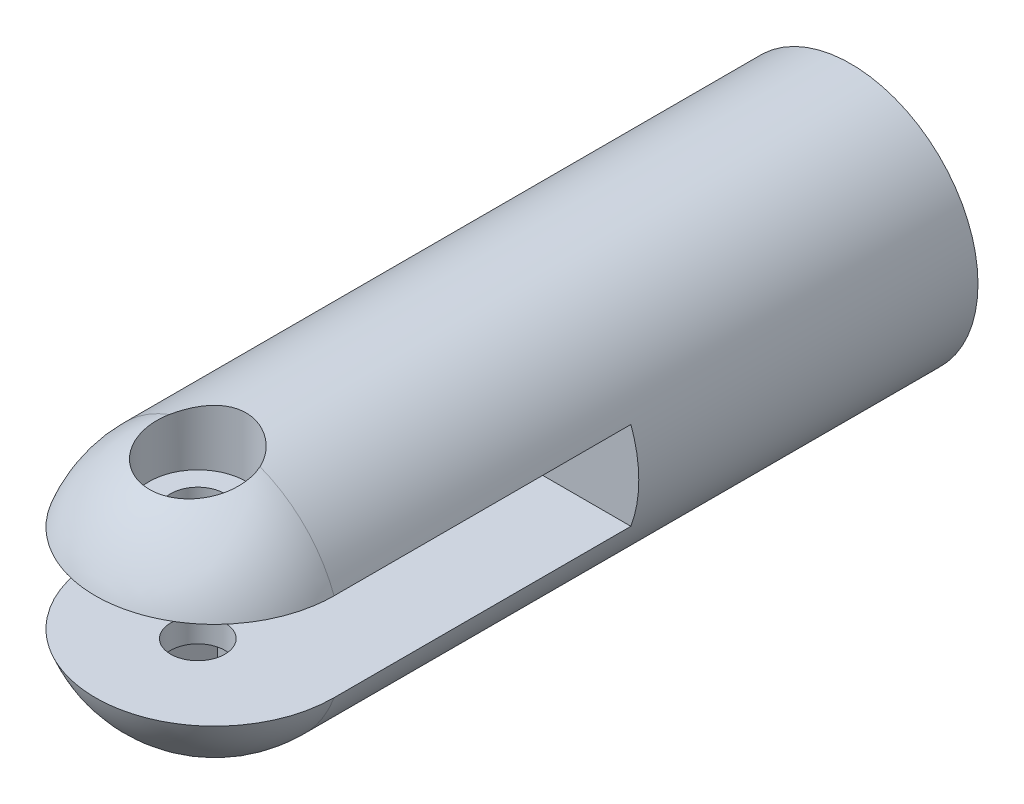
ISO-10303-21;
HEADER;
FILE_DESCRIPTION(('STEP AP214'),'2;1');
FILE_NAME('part.step','',(''),(''),'','','');
FILE_SCHEMA(('AUTOMOTIVE_DESIGN { 1 0 10303 214 1 1 1 1 }'));
ENDSEC;
DATA;
#1=APPLICATION_CONTEXT('core data for automotive mechanical design processes');
#2=APPLICATION_PROTOCOL_DEFINITION('international standard','automotive_design',2000,#1);
#3=PRODUCT_CONTEXT('',#1,'mechanical');
#4=PRODUCT('Part','Part','',(#3));
#5=PRODUCT_RELATED_PRODUCT_CATEGORY('part','',(#4));
#6=PRODUCT_DEFINITION_FORMATION('','',#4);
#7=PRODUCT_DEFINITION_CONTEXT('part definition',#1,'design');
#8=PRODUCT_DEFINITION('design','',#6,#7);
#9=PRODUCT_DEFINITION_SHAPE('','',#8);
#10=(LENGTH_UNIT() NAMED_UNIT(*) SI_UNIT(.MILLI.,.METRE.));
#11=(NAMED_UNIT(*) PLANE_ANGLE_UNIT() SI_UNIT($,.RADIAN.));
#12=(NAMED_UNIT(*) SI_UNIT($,.STERADIAN.) SOLID_ANGLE_UNIT());
#13=UNCERTAINTY_MEASURE_WITH_UNIT(LENGTH_MEASURE(1.E-05),#10,'distance_accuracy_value','');
#14=(GEOMETRIC_REPRESENTATION_CONTEXT(3) GLOBAL_UNCERTAINTY_ASSIGNED_CONTEXT((#13)) GLOBAL_UNIT_ASSIGNED_CONTEXT((#10,
#11,#12)) REPRESENTATION_CONTEXT('',''));
#15=CARTESIAN_POINT('',(0.,0.,0.));
#16=DIRECTION('',(0.,0.,1.));
#17=DIRECTION('',(1.,0.,0.));
#18=AXIS2_PLACEMENT_3D('',#15,#16,#17);
#19=CARTESIAN_POINT('',(0.,0.,-10.5));
#20=DIRECTION('',(0.,0.,-1.));
#21=DIRECTION('',(-1.,0.,0.));
#22=AXIS2_PLACEMENT_3D('',#19,#20,#21);
#23=PLANE('',#22);
#24=CARTESIAN_POINT('',(0.,0.,-10.5));
#25=DIRECTION('',(0.,0.,-1.));
#26=DIRECTION('',(-1.,0.,0.));
#27=AXIS2_PLACEMENT_3D('',#24,#25,#26);
#28=CIRCLE('',#27,3.);
#29=CARTESIAN_POINT('',(-3.,0.,-10.5));
#30=VERTEX_POINT('',#29);
#31=EDGE_CURVE('E217',#30,#30,#28,.T.);
#32=ORIENTED_EDGE('',*,*,#31,.T.);
#33=EDGE_LOOP('',(#32));
#34=FACE_BOUND('',#33,.T.);
#35=ADVANCED_FACE('F17',(#34),#23,.T.);
#36=CARTESIAN_POINT('',(-3.17500000000001,-7.5,16.));
#37=DIRECTION('',(-0.866025403784437,0.,0.500000000000002));
#38=DIRECTION('',(0.500000000000002,0.,0.866025403784437));
#39=AXIS2_PLACEMENT_3D('',#36,#37,#38);
#40=PLANE('',#39);
#41=DIRECTION('',(0.500000000000001,0.,0.866025403784438));
#42=VECTOR('',#41,1.);
#43=CARTESIAN_POINT('',(-3.17500000000001,-4.,16.));
#44=LINE('',#43,#42);
#45=CARTESIAN_POINT('',(-3.17500000000001,-4.,16.));
#46=VERTEX_POINT('',#45);
#47=CARTESIAN_POINT('',(-1.5875,-4.,18.7496306570156));
#48=VERTEX_POINT('',#47);
#49=EDGE_CURVE('E336',#46,#48,#44,.T.);
#50=ORIENTED_EDGE('',*,*,#49,.T.);
#51=DIRECTION('',(0.,1.,0.));
#52=VECTOR('',#51,1.);
#53=CARTESIAN_POINT('',(-1.5875,-7.5,18.7496306570156));
#54=LINE('',#53,#52);
#55=CARTESIAN_POINT('',(-1.58749999999999,-6.29842152336351,18.7496306570156));
#56=VERTEX_POINT('',#55);
#57=EDGE_CURVE('E337',#48,#56,#54,.F.);
#58=ORIENTED_EDGE('',*,*,#57,.T.);
#59=CARTESIAN_POINT('',(-3.17500000000001,-6.72081654265313,16.));
#60=CARTESIAN_POINT('',(-3.07960259323032,-6.74132007600086,16.1652331554354));
#61=CARTESIAN_POINT('',(-2.98376701938625,-6.75365654608878,16.3312252385059));
#62=CARTESIAN_POINT('',(-2.79187969375148,-6.76200191442739,16.6635838358338));
#63=CARTESIAN_POINT('',(-2.69582787083722,-6.75800428130594,16.8299504732809));
#64=CARTESIAN_POINT('',(-2.50613212754692,-6.73391120791016,17.1585131386392));
#65=CARTESIAN_POINT('',(-2.41247803994855,-6.71413434789136,17.3207267766961));
#66=CARTESIAN_POINT('',(-2.2263653028032,-6.65903730530723,17.6430834933676));
#67=CARTESIAN_POINT('',(-2.13390605968537,-6.62372517188927,17.803227600077));
#68=CARTESIAN_POINT('',(-1.96533097033463,-6.54463092953193,18.095208219723));
#69=CARTESIAN_POINT('',(-1.88895085376529,-6.50308354150593,18.2275024623091));
#70=CARTESIAN_POINT('',(-1.73719689092498,-6.40898598554046,18.4903480361984));
#71=CARTESIAN_POINT('',(-1.66183698273014,-6.35634589430505,18.6208752260456));
#72=CARTESIAN_POINT('',(-1.5875,-6.29842152336351,18.7496306570156));
#73=B_SPLINE_CURVE_WITH_KNOTS('',3,(#59,#60,#61,#62,#63,#64,#65,#66,#67,#68,#69,#70,#71,#72),
.UNSPECIFIED.,.F.,.F.,(4,2,2,2,2,2,4),(0.,0.575506309487109,1.15124276406334,1.71564068102141,
2.27974651547283,2.75429506405618,3.23284969624082),.UNSPECIFIED.);
#74=CARTESIAN_POINT('',(-3.17500000000001,-6.72081654265313,16.));
#75=VERTEX_POINT('',#74);
#76=EDGE_CURVE('E88',#75,#56,#73,.T.);
#77=ORIENTED_EDGE('',*,*,#76,.F.);
#78=DIRECTION('',(0.,1.,0.));
#79=VECTOR('',#78,1.);
#80=CARTESIAN_POINT('',(-3.17500000000001,-7.5,16.));
#81=LINE('',#80,#79);
#82=EDGE_CURVE('E93',#75,#46,#81,.T.);
#83=ORIENTED_EDGE('',*,*,#82,.T.);
#84=EDGE_LOOP('',(#50,#58,#77,#83));
#85=FACE_BOUND('',#84,.T.);
#86=ADVANCED_FACE('F218',(#85),#40,.F.);
#87=CARTESIAN_POINT('',(-1.5875,-7.5,18.7496306570156));
#88=DIRECTION('',(0.,0.,1.));
#89=DIRECTION('',(1.,0.,0.));
#90=AXIS2_PLACEMENT_3D('',#87,#88,#89);
#91=PLANE('',#90);
#92=DIRECTION('',(1.,0.,0.));
#93=VECTOR('',#92,1.);
#94=CARTESIAN_POINT('',(0.,-4.,18.7496306570156));
#95=LINE('',#94,#93);
#96=CARTESIAN_POINT('',(1.5875,-4.,18.7496306570156));
#97=VERTEX_POINT('',#96);
#98=EDGE_CURVE('E343',#48,#97,#95,.T.);
#99=ORIENTED_EDGE('',*,*,#98,.T.);
#100=DIRECTION('',(0.,1.,0.));
#101=VECTOR('',#100,1.);
#102=CARTESIAN_POINT('',(1.5875,-7.5,18.7496306570156));
#103=LINE('',#102,#101);
#104=CARTESIAN_POINT('',(1.5875,-6.29842152336351,18.7496306570156));
#105=VERTEX_POINT('',#104);
#106=EDGE_CURVE('E334',#97,#105,#103,.F.);
#107=ORIENTED_EDGE('',*,*,#106,.T.);
#108=CARTESIAN_POINT('',(0.,0.,18.7496306570156));
#109=DIRECTION('',(0.,0.,1.));
#110=DIRECTION('',(0.,-1.,0.));
#111=AXIS2_PLACEMENT_3D('',#108,#109,#110);
#112=CIRCLE('',#111,6.49540375465364);
#113=EDGE_CURVE('E208',#56,#105,#112,.T.);
#114=ORIENTED_EDGE('',*,*,#113,.F.);
#115=ORIENTED_EDGE('',*,*,#57,.F.);
#116=EDGE_LOOP('',(#99,#107,#114,#115));
#117=FACE_BOUND('',#116,.T.);
#118=ADVANCED_FACE('F222',(#117),#91,.F.);
#119=CARTESIAN_POINT('',(1.5875,-7.5,18.7496306570156));
#120=DIRECTION('',(0.86602540378444,0.,0.499999999999997));
#121=DIRECTION('',(0.499999999999997,0.,-0.86602540378444));
#122=AXIS2_PLACEMENT_3D('',#119,#120,#121);
#123=PLANE('',#122);
#124=DIRECTION('',(0.499999999999997,0.,-0.86602540378444));
#125=VECTOR('',#124,1.);
#126=CARTESIAN_POINT('',(1.5875,-4.,18.7496306570156));
#127=LINE('',#126,#125);
#128=CARTESIAN_POINT('',(3.175,-4.,16.));
#129=VERTEX_POINT('',#128);
#130=EDGE_CURVE('E340',#97,#129,#127,.T.);
#131=ORIENTED_EDGE('',*,*,#130,.T.);
#132=DIRECTION('',(0.,1.,0.));
#133=VECTOR('',#132,1.);
#134=CARTESIAN_POINT('',(3.175,-7.5,16.));
#135=LINE('',#134,#133);
#136=CARTESIAN_POINT('',(3.175,-6.72081654265313,16.));
#137=VERTEX_POINT('',#136);
#138=EDGE_CURVE('E155',#129,#137,#135,.F.);
#139=ORIENTED_EDGE('',*,*,#138,.T.);
#140=CARTESIAN_POINT('',(1.5875,-6.29842152336351,18.7496306570156));
#141=CARTESIAN_POINT('',(1.67689894076092,-6.3680948562576,18.5947871494749));
#142=CARTESIAN_POINT('',(1.76778844011114,-6.43011431273529,18.4373619187258));
#143=CARTESIAN_POINT('',(1.95191050481335,-6.53850660622946,18.118453147867));
#144=CARTESIAN_POINT('',(2.04514399262286,-6.5848731762415,17.9569680100141));
#145=CARTESIAN_POINT('',(2.23139119004389,-6.66080934737709,17.6343784013136));
#146=CARTESIAN_POINT('',(2.32437306711666,-6.69069176414406,17.4733290660404));
#147=CARTESIAN_POINT('',(2.51121485050455,-6.7348288203913,17.1497096042358));
#148=CARTESIAN_POINT('',(2.60507427752705,-6.74909153942559,16.9871403078635));
#149=CARTESIAN_POINT('',(2.77812542881541,-6.76089570494516,16.6874069215238));
#150=CARTESIAN_POINT('',(2.85728009953787,-6.76073232918896,16.5503070101761));
#151=CARTESIAN_POINT('',(3.01605649986623,-6.74925932676091,16.2752982177645));
#152=CARTESIAN_POINT('',(3.09567653133969,-6.73785561637948,16.1373922779522));
#153=CARTESIAN_POINT('',(3.175,-6.72081654265313,16.));
#154=B_SPLINE_CURVE_WITH_KNOTS('',3,(#140,#141,#142,#143,#144,#145,#146,#147,#148,#149,#150,
#151,#152,#153),.UNSPECIFIED.,.F.,.F.,(4,2,2,2,2,2,4),(0.,0.575506309487115,1.15124276406335,
1.71564068102142,2.27974651547283,2.75429506405619,3.23284969624082),.UNSPECIFIED.);
#155=EDGE_CURVE('E179',#105,#137,#154,.T.);
#156=ORIENTED_EDGE('',*,*,#155,.F.);
#157=ORIENTED_EDGE('',*,*,#106,.F.);
#158=EDGE_LOOP('',(#131,#139,#156,#157));
#159=FACE_BOUND('',#158,.T.);
#160=ADVANCED_FACE('F224',(#159),#123,.F.);
#161=CARTESIAN_POINT('',(0.,-4.,0.));
#162=DIRECTION('',(0.,1.,0.));
#163=DIRECTION('',(0.,0.,1.));
#164=AXIS2_PLACEMENT_3D('',#161,#162,#163);
#165=PLANE('',#164);
#166=CARTESIAN_POINT('',(0.,-4.,16.));
#167=DIRECTION('',(0.,1.,0.));
#168=DIRECTION('',(0.,0.,1.));
#169=AXIS2_PLACEMENT_3D('',#166,#167,#168);
#170=CIRCLE('',#169,1.6);
#171=CARTESIAN_POINT('',(0.,-4.,17.6));
#172=VERTEX_POINT('',#171);
#173=EDGE_CURVE('E20',#172,#172,#170,.T.);
#174=ORIENTED_EDGE('',*,*,#173,.T.);
#175=EDGE_LOOP('',(#174));
#176=FACE_BOUND('',#175,.T.);
#177=ORIENTED_EDGE('',*,*,#130,.F.);
#178=ORIENTED_EDGE('',*,*,#98,.F.);
#179=ORIENTED_EDGE('',*,*,#49,.F.);
#180=DIRECTION('',(-0.500000000000003,0.,0.866025403784437));
#181=VECTOR('',#180,1.);
#182=CARTESIAN_POINT('',(-1.5875,-4.,13.2503693429844));
#183=LINE('',#182,#181);
#184=CARTESIAN_POINT('',(-1.5875,-4.,13.2503693429844));
#185=VERTEX_POINT('',#184);
#186=EDGE_CURVE('E213',#46,#185,#183,.F.);
#187=ORIENTED_EDGE('',*,*,#186,.T.);
#188=DIRECTION('',(-1.,0.,0.));
#189=VECTOR('',#188,1.);
#190=CARTESIAN_POINT('',(1.5875,-4.,13.2503693429844));
#191=LINE('',#190,#189);
#192=CARTESIAN_POINT('',(1.5875,-4.,13.2503693429844));
#193=VERTEX_POINT('',#192);
#194=EDGE_CURVE('E146',#185,#193,#191,.F.);
#195=ORIENTED_EDGE('',*,*,#194,.T.);
#196=DIRECTION('',(-0.5,0.,-0.866025403784439));
#197=VECTOR('',#196,1.);
#198=CARTESIAN_POINT('',(3.175,-4.,16.));
#199=LINE('',#198,#197);
#200=EDGE_CURVE('E157',#193,#129,#199,.F.);
#201=ORIENTED_EDGE('',*,*,#200,.T.);
#202=EDGE_LOOP('',(#177,#178,#179,#187,#195,#201));
#203=FACE_BOUND('',#202,.T.);
#204=ADVANCED_FACE('F229',(#176,#203),#165,.F.);
#205=CARTESIAN_POINT('',(0.,7.5,16.));
#206=DIRECTION('',(0.,1.,0.));
#207=DIRECTION('',(0.,0.,1.));
#208=AXIS2_PLACEMENT_3D('',#205,#206,#207);
#209=CYLINDRICAL_SURFACE('',#208,1.6);
#210=CARTESIAN_POINT('',(0.,-2.6,16.));
#211=DIRECTION('',(0.,1.,0.));
#212=DIRECTION('',(0.,0.,1.));
#213=AXIS2_PLACEMENT_3D('',#210,#211,#212);
#214=CIRCLE('',#213,1.6);
#215=CARTESIAN_POINT('',(0.,-2.6,17.6));
#216=VERTEX_POINT('',#215);
#217=EDGE_CURVE('E307',#216,#216,#214,.T.);
#218=ORIENTED_EDGE('',*,*,#217,.T.);
#219=EDGE_LOOP('',(#218));
#220=FACE_BOUND('',#219,.T.);
#221=ORIENTED_EDGE('',*,*,#173,.F.);
#222=EDGE_LOOP('',(#221));
#223=FACE_BOUND('',#222,.T.);
#224=ADVANCED_FACE('F233',(#220,#223),#209,.F.);
#225=CARTESIAN_POINT('',(0.,0.,-22.5));
#226=DIRECTION('',(0.,0.,-1.));
#227=DIRECTION('',(-1.,0.,0.));
#228=AXIS2_PLACEMENT_3D('',#225,#226,#227);
#229=CYLINDRICAL_SURFACE('',#228,3.);
#230=ORIENTED_EDGE('',*,*,#31,.F.);
#231=EDGE_LOOP('',(#230));
#232=FACE_BOUND('',#231,.T.);
#233=CARTESIAN_POINT('',(0.,0.,-22.5));
#234=DIRECTION('',(0.,0.,-1.));
#235=DIRECTION('',(-1.,0.,0.));
#236=AXIS2_PLACEMENT_3D('',#233,#234,#235);
#237=CIRCLE('',#236,3.);
#238=CARTESIAN_POINT('',(-3.,0.,-22.5));
#239=VERTEX_POINT('',#238);
#240=EDGE_CURVE('E302',#239,#239,#237,.T.);
#241=ORIENTED_EDGE('',*,*,#240,.T.);
#242=EDGE_LOOP('',(#241));
#243=FACE_BOUND('',#242,.T.);
#244=ADVANCED_FACE('F236',(#232,#243),#229,.F.);
#245=CARTESIAN_POINT('',(-1.5875,-7.5,13.2503693429844));
#246=DIRECTION('',(-0.866025403784437,0.,-0.500000000000003));
#247=DIRECTION('',(-0.500000000000003,0.,0.866025403784437));
#248=AXIS2_PLACEMENT_3D('',#245,#246,#247);
#249=PLANE('',#248);
#250=ORIENTED_EDGE('',*,*,#186,.F.);
#251=ORIENTED_EDGE('',*,*,#82,.F.);
#252=CARTESIAN_POINT('',(-2.59764973081037,-7.03578111342449,15.));
#253=CARTESIAN_POINT('',(-2.696074031953,-6.99941252982038,15.1704758902785));
#254=CARTESIAN_POINT('',(-2.79339870495679,-6.95498119045404,15.3390471687511));
#255=CARTESIAN_POINT('',(-2.98584879468667,-6.84999300019691,15.6723805020844));
#256=CARTESIAN_POINT('',(-3.08097421141276,-6.78943614930613,15.8371425569452));
#257=CARTESIAN_POINT('',(-3.17500000000001,-6.72081654265313,16.));
#258=B_SPLINE_CURVE_WITH_KNOTS('',3,(#252,#253,#254,#255,#256,#257),.UNSPECIFIED.,.F.,.F.,(4,2,
4),(0.,0.59896795103874,1.19793590207748),.UNSPECIFIED.);
#259=CARTESIAN_POINT('',(-2.59764973081038,-7.03578111342449,15.));
#260=VERTEX_POINT('',#259);
#261=EDGE_CURVE('E199',#260,#75,#258,.T.);
#262=ORIENTED_EDGE('',*,*,#261,.F.);
#263=CARTESIAN_POINT('',(0.,0.,10.5007386859688));
#264=DIRECTION('',(-0.866025403784437,0.,-0.500000000000003));
#265=DIRECTION('',(-0.500000000000003,0.,0.866025403784437));
#266=AXIS2_PLACEMENT_3D('',#263,#264,#265);
#267=ELLIPSE('',#266,14.9999999999999,7.5);
#268=CARTESIAN_POINT('',(-1.5875,-7.33006437556997,13.2503693429844));
#269=VERTEX_POINT('',#268);
#270=EDGE_CURVE('E299',#269,#260,#267,.T.);
#271=ORIENTED_EDGE('',*,*,#270,.F.);
#272=DIRECTION('',(0.,1.,0.));
#273=VECTOR('',#272,1.);
#274=CARTESIAN_POINT('',(-1.5875,-7.5,13.2503693429844));
#275=LINE('',#274,#273);
#276=EDGE_CURVE('E149',#269,#185,#275,.T.);
#277=ORIENTED_EDGE('',*,*,#276,.T.);
#278=EDGE_LOOP('',(#250,#251,#262,#271,#277));
#279=FACE_BOUND('',#278,.T.);
#280=ADVANCED_FACE('F170',(#279),#249,.F.);
#281=CARTESIAN_POINT('',(0.,0.,15.));
#282=DIRECTION('',(0.,0.,1.));
#283=DIRECTION('',(-1.,2.29714510101894E-12,0.));
#284=AXIS2_PLACEMENT_3D('',#281,#282,#283);
#285=SPHERICAL_SURFACE('',#284,7.5);
#286=CARTESIAN_POINT('',(0.,0.,15.));
#287=DIRECTION('',(0.,0.,1.));
#288=DIRECTION('',(1.,0.,0.));
#289=AXIS2_PLACEMENT_3D('',#286,#287,#288);
#290=CIRCLE('',#289,7.5);
#291=CARTESIAN_POINT('',(-7.03491293478462,-2.6,15.));
#292=VERTEX_POINT('',#291);
#293=EDGE_CURVE('E135',#260,#292,#290,.F.);
#294=ORIENTED_EDGE('',*,*,#293,.F.);
#295=ORIENTED_EDGE('',*,*,#261,.T.);
#296=ORIENTED_EDGE('',*,*,#76,.T.);
#297=ORIENTED_EDGE('',*,*,#113,.T.);
#298=ORIENTED_EDGE('',*,*,#155,.T.);
#299=CARTESIAN_POINT('',(3.175,-6.72081654265313,16.));
#300=CARTESIAN_POINT('',(3.08097421141275,-6.78943614930614,15.8371425569452));
#301=CARTESIAN_POINT('',(2.98584879468666,-6.84999300019692,15.6723805020844));
#302=CARTESIAN_POINT('',(2.79339870495678,-6.95498119045404,15.3390471687511));
#303=CARTESIAN_POINT('',(2.696074031953,-6.99941252982038,15.1704758902785));
#304=CARTESIAN_POINT('',(2.59764973081037,-7.03578111342449,15.));
#305=B_SPLINE_CURVE_WITH_KNOTS('',3,(#299,#300,#301,#302,#303,#304),.UNSPECIFIED.,.F.,.F.,(4,2,
4),(0.,0.598967951038731,1.19793590207746),.UNSPECIFIED.);
#306=CARTESIAN_POINT('',(2.59764973081037,-7.03578111342449,15.));
#307=VERTEX_POINT('',#306);
#308=EDGE_CURVE('E152',#137,#307,#305,.T.);
#309=ORIENTED_EDGE('',*,*,#308,.T.);
#310=CARTESIAN_POINT('',(0.,0.,15.));
#311=DIRECTION('',(0.,0.,1.));
#312=DIRECTION('',(1.,0.,0.));
#313=AXIS2_PLACEMENT_3D('',#310,#311,#312);
#314=CIRCLE('',#313,7.5);
#315=CARTESIAN_POINT('',(7.03491293478462,-2.6,15.));
#316=VERTEX_POINT('',#315);
#317=EDGE_CURVE('E139',#316,#307,#314,.F.);
#318=ORIENTED_EDGE('',*,*,#317,.F.);
#319=CARTESIAN_POINT('',(7.03491293478462,-2.6,15.));
#320=CARTESIAN_POINT('',(7.03493420883234,-2.6,15.197859144871));
#321=CARTESIAN_POINT('',(7.02656655165062,-2.6,15.395715231548));
#322=CARTESIAN_POINT('',(6.99320702816144,-2.6,15.7900118824729));
#323=CARTESIAN_POINT('',(6.96821595785348,-2.6,15.9864525140435));
#324=CARTESIAN_POINT('',(6.90178658963581,-2.6,16.376390968229));
#325=CARTESIAN_POINT('',(6.86035986515518,-2.6,16.5698907623419));
#326=CARTESIAN_POINT('',(6.76136057221706,-2.6,16.9527122990096));
#327=CARTESIAN_POINT('',(6.70378819995777,-2.6,17.1420340923044));
#328=CARTESIAN_POINT('',(6.57288585762991,-2.6,17.5152103690321));
#329=CARTESIAN_POINT('',(6.49955137901679,-2.6,17.6990632709952));
#330=CARTESIAN_POINT('',(6.33762633980251,-2.6,18.0600050756256));
#331=CARTESIAN_POINT('',(6.24903015269791,-2.6,18.237091454169));
#332=CARTESIAN_POINT('',(6.05728483155218,-2.6,18.5830706788558));
#333=CARTESIAN_POINT('',(5.95414395934119,-2.6,18.7519681038877));
#334=CARTESIAN_POINT('',(5.7339636522641,-2.6,19.0805372721318));
#335=CARTESIAN_POINT('',(5.61691910184715,-2.6,19.2402055873769));
#336=CARTESIAN_POINT('',(5.36983710227033,-2.6,19.549059917541));
#337=CARTESIAN_POINT('',(5.23980417514852,-2.6,19.6982495501239));
#338=CARTESIAN_POINT('',(4.96758516280946,-2.6,19.9852003985882));
#339=CARTESIAN_POINT('',(4.82539460757921,-2.6,20.1229573740046));
#340=CARTESIAN_POINT('',(4.52994491676588,-2.6,20.3859732274426));
#341=CARTESIAN_POINT('',(4.37668818571246,-2.6,20.5112348065408));
#342=CARTESIAN_POINT('',(4.06010965526053,-2.6,20.7484473468962));
#343=CARTESIAN_POINT('',(3.89678415980704,-2.6,20.8603933755573));
#344=CARTESIAN_POINT('',(3.5613504477013,-2.6,21.0700813921502));
#345=CARTESIAN_POINT('',(3.38924588862587,-2.6,21.1678292311406));
#346=CARTESIAN_POINT('',(3.03735005864662,-2.6,21.3485146653958));
#347=CARTESIAN_POINT('',(2.85755597390618,-2.6,21.4314467806508));
#348=CARTESIAN_POINT('',(2.49169855743188,-2.6,21.5818339727262));
#349=CARTESIAN_POINT('',(2.30563797076146,-2.6,21.6492957278108));
#350=CARTESIAN_POINT('',(1.92842648654879,-2.6,21.7683306709677));
#351=CARTESIAN_POINT('',(1.73727374092885,-2.6,21.8198980027816));
#352=CARTESIAN_POINT('',(1.3513367841485,-2.6,21.9067361449457));
#353=CARTESIAN_POINT('',(1.15655321073654,-2.6,21.9420097897085));
#354=CARTESIAN_POINT('',(0.76470278455332,-2.6,21.9960236225678));
#355=CARTESIAN_POINT('',(0.567635883402742,-2.6,22.0147634596932));
#356=CARTESIAN_POINT('',(0.172621456489622,-2.6,22.0355752931889));
#357=CARTESIAN_POINT('',(-0.0253260801850322,-2.6,22.0376470824435));
#358=CARTESIAN_POINT('',(-0.420692027613619,-2.6,22.0251075498384));
#359=CARTESIAN_POINT('',(-0.618110438365217,-2.6,22.0104962279052));
#360=CARTESIAN_POINT('',(-1.01101471259611,-2.6,21.9646943340337));
#361=CARTESIAN_POINT('',(-1.206500574773,-2.6,21.933503750923));
#362=CARTESIAN_POINT('',(-1.59414565786907,-2.6,21.8547659258986));
#363=CARTESIAN_POINT('',(-1.78630494927555,-2.6,21.8072190310083));
#364=CARTESIAN_POINT('',(-2.16597144662933,-2.6,21.6960957950553));
#365=CARTESIAN_POINT('',(-2.35347775505742,-2.6,21.6325163874595));
#366=CARTESIAN_POINT('',(-2.72239857336446,-2.6,21.489811131103));
#367=CARTESIAN_POINT('',(-2.90381529903764,-2.6,21.4106910104851));
#368=CARTESIAN_POINT('',(-3.2594103848253,-2.6,21.2374175111798));
#369=CARTESIAN_POINT('',(-3.43358585843102,-2.6,21.1432582086293));
#370=CARTESIAN_POINT('',(-3.77332075033645,-2.6,20.940635912819));
#371=CARTESIAN_POINT('',(-3.93888332456384,-2.6,20.8321782109824));
#372=CARTESIAN_POINT('',(-4.26033636069043,-2.6,20.6016661362568));
#373=CARTESIAN_POINT('',(-4.41622371185031,-2.6,20.4796074253242));
#374=CARTESIAN_POINT('',(-4.71710432899512,-2.6,20.2228371040429));
#375=CARTESIAN_POINT('',(-4.86210159508594,-2.6,20.0881301809057));
#376=CARTESIAN_POINT('',(-5.14026796057101,-2.6,19.8069495698688));
#377=CARTESIAN_POINT('',(-5.27343427732898,-2.6,19.6604731291282));
#378=CARTESIAN_POINT('',(-5.52690685396906,-2.6,19.3568785582275));
#379=CARTESIAN_POINT('',(-5.64721784023694,-2.6,19.1997643740849));
#380=CARTESIAN_POINT('',(-5.87425946028427,-2.6,18.8758508242758));
#381=CARTESIAN_POINT('',(-5.9809806973143,-2.6,18.7090448719717));
#382=CARTESIAN_POINT('',(-6.17994980688439,-2.6,18.3670959744245));
#383=CARTESIAN_POINT('',(-6.27220300755223,-2.6,18.1919561294125));
#384=CARTESIAN_POINT('',(-6.44171092607126,-2.6,17.8343522369936));
#385=CARTESIAN_POINT('',(-6.51895082931358,-2.6,17.6518811674281));
#386=CARTESIAN_POINT('',(-6.6577430021067,-2.6,17.2811442410193));
#387=CARTESIAN_POINT('',(-6.71930116033102,-2.6,17.092880589209));
#388=CARTESIAN_POINT('',(-6.82627027444954,-2.6,16.7120497048717));
#389=CARTESIAN_POINT('',(-6.87169894641718,-2.6,16.5194874425207));
#390=CARTESIAN_POINT('',(-6.94616400962334,-2.6,16.1312979784956));
#391=CARTESIAN_POINT('',(-6.97520844755946,-2.6,15.9356723299293));
#392=CARTESIAN_POINT('',(-7.00895018247945,-2.6,15.6163507740296));
#393=CARTESIAN_POINT('',(-7.01869242025606,-2.6,15.4931660136771));
#394=CARTESIAN_POINT('',(-7.03166913398976,-2.6,15.2466584434803));
#395=CARTESIAN_POINT('',(-7.03491434166158,-2.6,15.1233361985076));
#396=CARTESIAN_POINT('',(-7.03491293478462,-2.6,15.));
#397=B_SPLINE_CURVE_WITH_KNOTS('',3,(#319,#320,#321,#322,#323,#324,#325,#326,#327,#328,#329,
#330,#331,#332,#333,#334,#335,#336,#337,#338,#339,#340,#341,#342,#343,#344,#345,#346,#347,#348,
#349,#350,#351,#352,#353,#354,#355,#356,#357,#358,#359,#360,#361,#362,#363,#364,#365,#366,#367,
#368,#369,#370,#371,#372,#373,#374,#375,#376,#377,#378,#379,#380,#381,#382,#383,#384,#385,#386,
#387,#388,#389,#390,#391,#392,#393,#394,#395,#396),.UNSPECIFIED.,.F.,.F.,(4,2,2,2,2,2,2,2,2,2,2,
2,2,2,2,2,2,2,2,2,2,2,2,2,2,2,2,2,2,2,2,2,2,2,2,2,2,2,4),(0.,0.593396260274599,1.18676410826616,
1.77971486627992,2.37265841920477,2.96577180213255,3.55910431679311,4.15210114778725,
4.74531683858551,5.33832671035601,5.93155556030732,6.52465589534588,7.11797525797439,
7.71104941638823,8.30434248772485,8.89737896142336,9.49063367737369,10.0837851531887,
10.6769492198093,11.2701206570194,11.8632920968468,12.4564639364045,13.0496231917164,
13.6428959865603,14.2359505162849,14.8292392261303,15.4223089901307,16.0155684581985,
16.6086089356848,17.2017885289078,17.7947492780517,18.3881178340055,18.9812673550325,
19.5749992370071,20.168507836168,20.7613625144021,21.3539257731583,21.7244765119154,
22.0944146728365),.UNSPECIFIED.);
#398=EDGE_CURVE('E145',#316,#292,#397,.T.);
#399=ORIENTED_EDGE('',*,*,#398,.T.);
#400=EDGE_LOOP('',(#294,#295,#296,#297,#298,#309,#318,#399));
#401=FACE_BOUND('',#400,.T.);
#402=ADVANCED_FACE('F164',(#401),#285,.T.);
#403=CARTESIAN_POINT('',(3.175,-7.5,16.));
#404=DIRECTION('',(0.866025403784439,0.,-0.5));
#405=DIRECTION('',(-0.5,0.,-0.866025403784439));
#406=AXIS2_PLACEMENT_3D('',#403,#404,#405);
#407=PLANE('',#406);
#408=ORIENTED_EDGE('',*,*,#138,.F.);
#409=ORIENTED_EDGE('',*,*,#200,.F.);
#410=DIRECTION('',(0.,1.,0.));
#411=VECTOR('',#410,1.);
#412=CARTESIAN_POINT('',(1.5875,-7.5,13.2503693429844));
#413=LINE('',#412,#411);
#414=CARTESIAN_POINT('',(1.5875,-7.33006437556997,13.2503693429844));
#415=VERTEX_POINT('',#414);
#416=EDGE_CURVE('E143',#193,#415,#413,.F.);
#417=ORIENTED_EDGE('',*,*,#416,.T.);
#418=CARTESIAN_POINT('',(0.,0.,10.5007386859688));
#419=DIRECTION('',(0.866025403784439,0.,-0.5));
#420=DIRECTION('',(0.5,0.,0.866025403784439));
#421=AXIS2_PLACEMENT_3D('',#418,#419,#420);
#422=ELLIPSE('',#421,15.,7.5);
#423=EDGE_CURVE('E290',#307,#415,#422,.T.);
#424=ORIENTED_EDGE('',*,*,#423,.F.);
#425=ORIENTED_EDGE('',*,*,#308,.F.);
#426=EDGE_LOOP('',(#408,#409,#417,#424,#425));
#427=FACE_BOUND('',#426,.T.);
#428=ADVANCED_FACE('F169',(#427),#407,.F.);
#429=CARTESIAN_POINT('',(1.5875,-7.5,13.2503693429844));
#430=DIRECTION('',(0.,0.,-1.));
#431=DIRECTION('',(-1.,0.,0.));
#432=AXIS2_PLACEMENT_3D('',#429,#430,#431);
#433=PLANE('',#432);
#434=ORIENTED_EDGE('',*,*,#194,.F.);
#435=ORIENTED_EDGE('',*,*,#276,.F.);
#436=CARTESIAN_POINT('',(0.,0.,13.2503693429844));
#437=DIRECTION('',(0.,0.,1.));
#438=DIRECTION('',(1.,0.,0.));
#439=AXIS2_PLACEMENT_3D('',#436,#437,#438);
#440=CIRCLE('',#439,7.5);
#441=EDGE_CURVE('E288',#415,#269,#440,.F.);
#442=ORIENTED_EDGE('',*,*,#441,.F.);
#443=ORIENTED_EDGE('',*,*,#416,.F.);
#444=EDGE_LOOP('',(#434,#435,#442,#443));
#445=FACE_BOUND('',#444,.T.);
#446=ADVANCED_FACE('F319',(#445),#433,.F.);
#447=CARTESIAN_POINT('',(-7.03491293478462,-2.6,22.5));
#448=DIRECTION('',(0.,-1.,0.));
#449=DIRECTION('',(0.,0.,-1.));
#450=AXIS2_PLACEMENT_3D('',#447,#448,#449);
#451=PLANE('',#450);
#452=ORIENTED_EDGE('',*,*,#217,.F.);
#453=EDGE_LOOP('',(#452));
#454=FACE_BOUND('',#453,.T.);
#455=DIRECTION('',(0.,0.,1.));
#456=VECTOR('',#455,1.);
#457=CARTESIAN_POINT('',(7.03491293478462,-2.6,-22.5));
#458=LINE('',#457,#456);
#459=CARTESIAN_POINT('',(7.03491293478462,-2.6,-2.5));
#460=VERTEX_POINT('',#459);
#461=EDGE_CURVE('E137',#460,#316,#458,.T.);
#462=ORIENTED_EDGE('',*,*,#461,.F.);
#463=DIRECTION('',(1.,0.,0.));
#464=VECTOR('',#463,1.);
#465=CARTESIAN_POINT('',(0.,-2.6,-2.5));
#466=LINE('',#465,#464);
#467=CARTESIAN_POINT('',(-7.03491293478462,-2.6,-2.5));
#468=VERTEX_POINT('',#467);
#469=EDGE_CURVE('E117',#468,#460,#466,.T.);
#470=ORIENTED_EDGE('',*,*,#469,.F.);
#471=DIRECTION('',(0.,0.,1.));
#472=VECTOR('',#471,1.);
#473=CARTESIAN_POINT('',(-7.03491293478462,-2.6,-22.5));
#474=LINE('',#473,#472);
#475=EDGE_CURVE('E140',#292,#468,#474,.F.);
#476=ORIENTED_EDGE('',*,*,#475,.F.);
#477=ORIENTED_EDGE('',*,*,#398,.F.);
#478=EDGE_LOOP('',(#462,#470,#476,#477));
#479=FACE_BOUND('',#478,.T.);
#480=ADVANCED_FACE('F313',(#454,#479),#451,.F.);
#481=CARTESIAN_POINT('',(0.,7.5,16.));
#482=DIRECTION('',(0.,1.,0.));
#483=DIRECTION('',(0.,0.,1.));
#484=AXIS2_PLACEMENT_3D('',#481,#482,#483);
#485=CYLINDRICAL_SURFACE('',#484,1.6);
#486=CARTESIAN_POINT('',(0.,2.6,16.));
#487=DIRECTION('',(0.,1.,0.));
#488=DIRECTION('',(0.,0.,1.));
#489=AXIS2_PLACEMENT_3D('',#486,#487,#488);
#490=CIRCLE('',#489,1.6);
#491=CARTESIAN_POINT('',(0.,2.6,17.6));
#492=VERTEX_POINT('',#491);
#493=EDGE_CURVE('E116',#492,#492,#490,.F.);
#494=ORIENTED_EDGE('',*,*,#493,.T.);
#495=EDGE_LOOP('',(#494));
#496=FACE_BOUND('',#495,.T.);
#497=CARTESIAN_POINT('',(0.,4.,16.));
#498=DIRECTION('',(0.,1.,0.));
#499=DIRECTION('',(0.,0.,1.));
#500=AXIS2_PLACEMENT_3D('',#497,#498,#499);
#501=CIRCLE('',#500,1.6);
#502=CARTESIAN_POINT('',(0.,4.,17.6));
#503=VERTEX_POINT('',#502);
#504=EDGE_CURVE('E305',#503,#503,#501,.F.);
#505=ORIENTED_EDGE('',*,*,#504,.F.);
#506=EDGE_LOOP('',(#505));
#507=FACE_BOUND('',#506,.T.);
#508=ADVANCED_FACE('F364',(#496,#507),#485,.F.);
#509=CARTESIAN_POINT('',(0.,4.,0.));
#510=DIRECTION('',(0.,1.,0.));
#511=DIRECTION('',(0.,0.,1.));
#512=AXIS2_PLACEMENT_3D('',#509,#510,#511);
#513=PLANE('',#512);
#514=ORIENTED_EDGE('',*,*,#504,.T.);
#515=EDGE_LOOP('',(#514));
#516=FACE_BOUND('',#515,.T.);
#517=CARTESIAN_POINT('',(0.,4.,16.));
#518=DIRECTION('',(0.,1.,0.));
#519=DIRECTION('',(0.,0.,1.));
#520=AXIS2_PLACEMENT_3D('',#517,#518,#519);
#521=CIRCLE('',#520,2.85);
#522=CARTESIAN_POINT('',(0.,4.,18.85));
#523=VERTEX_POINT('',#522);
#524=EDGE_CURVE('E275',#523,#523,#521,.T.);
#525=ORIENTED_EDGE('',*,*,#524,.T.);
#526=EDGE_LOOP('',(#525));
#527=FACE_BOUND('',#526,.T.);
#528=ADVANCED_FACE('F370',(#516,#527),#513,.T.);
#529=CARTESIAN_POINT('',(0.,0.,-22.5));
#530=DIRECTION('',(0.,0.,1.));
#531=DIRECTION('',(1.,0.,0.));
#532=AXIS2_PLACEMENT_3D('',#529,#530,#531);
#533=PLANE('',#532);
#534=ORIENTED_EDGE('',*,*,#240,.F.);
#535=EDGE_LOOP('',(#534));
#536=FACE_BOUND('',#535,.T.);
#537=CARTESIAN_POINT('',(0.,0.,-22.5));
#538=DIRECTION('',(0.,0.,1.));
#539=DIRECTION('',(1.,0.,0.));
#540=AXIS2_PLACEMENT_3D('',#537,#538,#539);
#541=CIRCLE('',#540,7.5);
#542=CARTESIAN_POINT('',(7.5,0.,-22.5));
#543=VERTEX_POINT('',#542);
#544=EDGE_CURVE('E126',#543,#543,#541,.T.);
#545=ORIENTED_EDGE('',*,*,#544,.F.);
#546=EDGE_LOOP('',(#545));
#547=FACE_BOUND('',#546,.T.);
#548=ADVANCED_FACE('F374',(#536,#547),#533,.F.);
#549=CARTESIAN_POINT('',(0.,0.,-2.5));
#550=DIRECTION('',(0.,0.,1.));
#551=DIRECTION('',(1.,0.,0.));
#552=AXIS2_PLACEMENT_3D('',#549,#550,#551);
#553=PLANE('',#552);
#554=ORIENTED_EDGE('',*,*,#469,.T.);
#555=CARTESIAN_POINT('',(0.,0.,-2.5));
#556=DIRECTION('',(0.,0.,1.));
#557=DIRECTION('',(1.,0.,0.));
#558=AXIS2_PLACEMENT_3D('',#555,#556,#557);
#559=CIRCLE('',#558,7.5);
#560=CARTESIAN_POINT('',(7.03491293478462,2.6,-2.5));
#561=VERTEX_POINT('',#560);
#562=EDGE_CURVE('E120',#561,#460,#559,.F.);
#563=ORIENTED_EDGE('',*,*,#562,.F.);
#564=DIRECTION('',(1.,0.,0.));
#565=VECTOR('',#564,1.);
#566=CARTESIAN_POINT('',(7.03491293478462,2.6,-2.5));
#567=LINE('',#566,#565);
#568=CARTESIAN_POINT('',(-7.03491293478462,2.6,-2.5));
#569=VERTEX_POINT('',#568);
#570=EDGE_CURVE('E105',#561,#569,#567,.F.);
#571=ORIENTED_EDGE('',*,*,#570,.T.);
#572=CARTESIAN_POINT('',(0.,0.,-2.5));
#573=DIRECTION('',(0.,0.,1.));
#574=DIRECTION('',(1.,0.,0.));
#575=AXIS2_PLACEMENT_3D('',#572,#573,#574);
#576=CIRCLE('',#575,7.5);
#577=EDGE_CURVE('E268',#468,#569,#576,.F.);
#578=ORIENTED_EDGE('',*,*,#577,.F.);
#579=EDGE_LOOP('',(#554,#563,#571,#578));
#580=FACE_BOUND('',#579,.T.);
#581=ADVANCED_FACE('F121',(#580),#553,.T.);
#582=CARTESIAN_POINT('',(7.03491293478462,2.6,22.5));
#583=DIRECTION('',(0.,1.,0.));
#584=DIRECTION('',(0.,0.,1.));
#585=AXIS2_PLACEMENT_3D('',#582,#583,#584);
#586=PLANE('',#585);
#587=ORIENTED_EDGE('',*,*,#493,.F.);
#588=EDGE_LOOP('',(#587));
#589=FACE_BOUND('',#588,.T.);
#590=DIRECTION('',(0.,0.,1.));
#591=VECTOR('',#590,1.);
#592=CARTESIAN_POINT('',(-7.03491293478462,2.6,-22.5));
#593=LINE('',#592,#591);
#594=CARTESIAN_POINT('',(-7.03491293478462,2.6,15.));
#595=VERTEX_POINT('',#594);
#596=EDGE_CURVE('E114',#569,#595,#593,.T.);
#597=ORIENTED_EDGE('',*,*,#596,.F.);
#598=ORIENTED_EDGE('',*,*,#570,.F.);
#599=DIRECTION('',(0.,0.,1.));
#600=VECTOR('',#599,1.);
#601=CARTESIAN_POINT('',(7.03491293478462,2.6,-22.5));
#602=LINE('',#601,#600);
#603=CARTESIAN_POINT('',(7.03491293478462,2.6,15.));
#604=VERTEX_POINT('',#603);
#605=EDGE_CURVE('E111',#604,#561,#602,.F.);
#606=ORIENTED_EDGE('',*,*,#605,.F.);
#607=CARTESIAN_POINT('',(-7.03491293478462,2.6,15.));
#608=CARTESIAN_POINT('',(-7.03493420883234,2.6,15.197859144871));
#609=CARTESIAN_POINT('',(-7.02656655165062,2.6,15.395715231548));
#610=CARTESIAN_POINT('',(-6.99320702816144,2.6,15.7900118824729));
#611=CARTESIAN_POINT('',(-6.96821595785348,2.6,15.9864525140435));
#612=CARTESIAN_POINT('',(-6.90178658963581,2.6,16.376390968229));
#613=CARTESIAN_POINT('',(-6.86035986515518,2.6,16.5698907623419));
#614=CARTESIAN_POINT('',(-6.76136057221706,2.6,16.9527122990096));
#615=CARTESIAN_POINT('',(-6.70378819995777,2.6,17.1420340923044));
#616=CARTESIAN_POINT('',(-6.57288585762991,2.6,17.5152103690321));
#617=CARTESIAN_POINT('',(-6.49955137901679,2.6,17.6990632709952));
#618=CARTESIAN_POINT('',(-6.33762633980251,2.6,18.0600050756256));
#619=CARTESIAN_POINT('',(-6.24903015269791,2.6,18.237091454169));
#620=CARTESIAN_POINT('',(-6.05728483155218,2.6,18.5830706788558));
#621=CARTESIAN_POINT('',(-5.95414395934119,2.6,18.7519681038877));
#622=CARTESIAN_POINT('',(-5.7339636522641,2.6,19.0805372721318));
#623=CARTESIAN_POINT('',(-5.61691910184715,2.6,19.2402055873769));
#624=CARTESIAN_POINT('',(-5.36983710227033,2.6,19.549059917541));
#625=CARTESIAN_POINT('',(-5.23980417514851,2.6,19.6982495501239));
#626=CARTESIAN_POINT('',(-4.96758516280946,2.6,19.9852003985882));
#627=CARTESIAN_POINT('',(-4.82539460757921,2.6,20.1229573740046));
#628=CARTESIAN_POINT('',(-4.52994491676588,2.6,20.3859732274426));
#629=CARTESIAN_POINT('',(-4.37668818571245,2.6,20.5112348065408));
#630=CARTESIAN_POINT('',(-4.06010965526052,2.6,20.7484473468962));
#631=CARTESIAN_POINT('',(-3.89678415980703,2.6,20.8603933755573));
#632=CARTESIAN_POINT('',(-3.5613504477013,2.6,21.0700813921502));
#633=CARTESIAN_POINT('',(-3.38924588862587,2.6,21.1678292311406));
#634=CARTESIAN_POINT('',(-3.03735005864662,2.6,21.3485146653958));
#635=CARTESIAN_POINT('',(-2.85755597390618,2.6,21.4314467806508));
#636=CARTESIAN_POINT('',(-2.49169855743188,2.6,21.5818339727262));
#637=CARTESIAN_POINT('',(-2.30563797076147,2.6,21.6492957278108));
#638=CARTESIAN_POINT('',(-1.92842648654879,2.6,21.7683306709677));
#639=CARTESIAN_POINT('',(-1.73727374092885,2.6,21.8198980027816));
#640=CARTESIAN_POINT('',(-1.3513367841485,2.6,21.9067361449457));
#641=CARTESIAN_POINT('',(-1.15655321073654,2.6,21.9420097897085));
#642=CARTESIAN_POINT('',(-0.764702784553322,2.6,21.9960236225678));
#643=CARTESIAN_POINT('',(-0.567635883402744,2.6,22.0147634596932));
#644=CARTESIAN_POINT('',(-0.172621456489625,2.6,22.0355752931889));
#645=CARTESIAN_POINT('',(0.0253260801850297,2.6,22.0376470824435));
#646=CARTESIAN_POINT('',(0.420692027613617,2.6,22.0251075498384));
#647=CARTESIAN_POINT('',(0.618110438365215,2.59999999999999,22.0104962279052));
#648=CARTESIAN_POINT('',(1.01101471259611,2.59999999999999,21.9646943340337));
#649=CARTESIAN_POINT('',(1.206500574773,2.6,21.933503750923));
#650=CARTESIAN_POINT('',(1.59414565786906,2.6,21.8547659258986));
#651=CARTESIAN_POINT('',(1.78630494927554,2.6,21.8072190310083));
#652=CARTESIAN_POINT('',(2.16597144662933,2.6,21.6960957950553));
#653=CARTESIAN_POINT('',(2.35347775505741,2.6,21.6325163874595));
#654=CARTESIAN_POINT('',(2.72239857336445,2.6,21.489811131103));
#655=CARTESIAN_POINT('',(2.90381529903763,2.6,21.4106910104851));
#656=CARTESIAN_POINT('',(3.2594103848253,2.6,21.2374175111798));
#657=CARTESIAN_POINT('',(3.43358585843101,2.6,21.1432582086293));
#658=CARTESIAN_POINT('',(3.77332075033645,2.6,20.940635912819));
#659=CARTESIAN_POINT('',(3.93888332456385,2.6,20.8321782109824));
#660=CARTESIAN_POINT('',(4.26033636069043,2.6,20.6016661362568));
#661=CARTESIAN_POINT('',(4.41622371185031,2.6,20.4796074253242));
#662=CARTESIAN_POINT('',(4.71710432899511,2.6,20.2228371040429));
#663=CARTESIAN_POINT('',(4.86210159508594,2.6,20.0881301809057));
#664=CARTESIAN_POINT('',(5.14026796057101,2.6,19.8069495698688));
#665=CARTESIAN_POINT('',(5.27343427732898,2.6,19.6604731291282));
#666=CARTESIAN_POINT('',(5.52690685396906,2.6,19.3568785582275));
#667=CARTESIAN_POINT('',(5.64721784023694,2.6,19.1997643740849));
#668=CARTESIAN_POINT('',(5.87425946028427,2.6,18.8758508242758));
#669=CARTESIAN_POINT('',(5.9809806973143,2.6,18.7090448719717));
#670=CARTESIAN_POINT('',(6.17994980688439,2.6,18.3670959744245));
#671=CARTESIAN_POINT('',(6.27220300755224,2.6,18.1919561294125));
#672=CARTESIAN_POINT('',(6.44171092607126,2.6,17.8343522369936));
#673=CARTESIAN_POINT('',(6.51895082931358,2.6,17.6518811674281));
#674=CARTESIAN_POINT('',(6.6577430021067,2.6,17.2811442410193));
#675=CARTESIAN_POINT('',(6.71930116033102,2.6,17.092880589209));
#676=CARTESIAN_POINT('',(6.82627027444954,2.6,16.7120497048717));
#677=CARTESIAN_POINT('',(6.87169894641718,2.6,16.5194874425207));
#678=CARTESIAN_POINT('',(6.94616400962334,2.6,16.1312979784956));
#679=CARTESIAN_POINT('',(6.97520844755946,2.6,15.9356723299293));
#680=CARTESIAN_POINT('',(7.00895018247945,2.6,15.6163507740296));
#681=CARTESIAN_POINT('',(7.01869242025606,2.6,15.4931660136771));
#682=CARTESIAN_POINT('',(7.03166913398976,2.6,15.2466584434803));
#683=CARTESIAN_POINT('',(7.03491434166158,2.6,15.1233361985076));
#684=CARTESIAN_POINT('',(7.03491293478462,2.6,15.));
#685=B_SPLINE_CURVE_WITH_KNOTS('',3,(#607,#608,#609,#610,#611,#612,#613,#614,#615,#616,#617,
#618,#619,#620,#621,#622,#623,#624,#625,#626,#627,#628,#629,#630,#631,#632,#633,#634,#635,#636,
#637,#638,#639,#640,#641,#642,#643,#644,#645,#646,#647,#648,#649,#650,#651,#652,#653,#654,#655,
#656,#657,#658,#659,#660,#661,#662,#663,#664,#665,#666,#667,#668,#669,#670,#671,#672,#673,#674,
#675,#676,#677,#678,#679,#680,#681,#682,#683,#684),.UNSPECIFIED.,.F.,.F.,(4,2,2,2,2,2,2,2,2,2,2,
2,2,2,2,2,2,2,2,2,2,2,2,2,2,2,2,2,2,2,2,2,2,2,2,2,2,2,4),(0.,0.593396260274599,1.18676410826616,
1.77971486627992,2.37265841920477,2.96577180213255,3.55910431679311,4.15210114778726,
4.74531683858551,5.33832671035602,5.93155556030733,6.52465589534589,7.1179752579744,
7.71104941638823,8.30434248772485,8.89737896142336,9.49063367737369,10.0837851531887,
10.6769492198093,11.2701206570194,11.8632920968468,12.4564639364045,13.0496231917164,
13.6428959865603,14.2359505162849,14.8292392261303,15.4223089901307,16.0155684581985,
16.6086089356848,17.2017885289078,17.7947492780517,18.3881178340055,18.9812673550325,
19.5749992370071,20.168507836168,20.7613625144021,21.3539257731583,21.7244765119154,
22.0944146728366),.UNSPECIFIED.);
#686=EDGE_CURVE('E387',#595,#604,#685,.T.);
#687=ORIENTED_EDGE('',*,*,#686,.F.);
#688=EDGE_LOOP('',(#597,#598,#606,#687));
#689=FACE_BOUND('',#688,.T.);
#690=ADVANCED_FACE('F109',(#589,#689),#586,.F.);
#691=CARTESIAN_POINT('',(0.,0.,15.));
#692=DIRECTION('',(0.,0.,1.));
#693=DIRECTION('',(1.,-2.29703342818522E-12,0.));
#694=AXIS2_PLACEMENT_3D('',#691,#692,#693);
#695=SPHERICAL_SURFACE('',#694,7.5);
#696=CARTESIAN_POINT('',(0.,0.,15.));
#697=DIRECTION('',(0.,0.,1.));
#698=DIRECTION('',(1.,0.,0.));
#699=AXIS2_PLACEMENT_3D('',#696,#697,#698);
#700=CIRCLE('',#699,7.5);
#701=CARTESIAN_POINT('',(2.6688012290165,7.00910122626289,15.));
#702=VERTEX_POINT('',#701);
#703=EDGE_CURVE('E130',#702,#604,#700,.F.);
#704=ORIENTED_EDGE('',*,*,#703,.F.);
#705=CARTESIAN_POINT('',(2.6688012290165,7.00910122626289,15.));
#706=CARTESIAN_POINT('',(2.69873643573635,6.99770707030016,15.0798647625761));
#707=CARTESIAN_POINT('',(2.72505712911166,6.98609657619262,15.1610472429978));
#708=CARTESIAN_POINT('',(2.77031699329,6.96253200097295,15.3253929610906));
#709=CARTESIAN_POINT('',(2.78925642770088,6.95057793214732,15.4085561279127));
#710=CARTESIAN_POINT('',(2.81958505475836,6.92642910770609,15.576112776032));
#711=CARTESIAN_POINT('',(2.83098336703342,6.914234661239,15.6605046446832));
#712=CARTESIAN_POINT('',(2.84619297027292,6.88968900023404,15.8299182423619));
#713=CARTESIAN_POINT('',(2.85000469934578,6.87733779479011,15.9149399347338));
#714=CARTESIAN_POINT('',(2.84999107327851,6.84141042439244,16.1615772807692));
#715=CARTESIAN_POINT('',(2.83621112088597,6.81773150690225,16.3232930245344));
#716=CARTESIAN_POINT('',(2.78145944140352,6.77082453201554,16.6419931696121));
#717=CARTESIAN_POINT('',(2.74049464400263,6.74759636127184,16.798978766028));
#718=CARTESIAN_POINT('',(2.6324820329848,6.7022475795291,17.1039457259828));
#719=CARTESIAN_POINT('',(2.56542803070643,6.68012723272503,17.2519249434656));
#720=CARTESIAN_POINT('',(2.40703740721161,6.63768025399247,17.5345759932658));
#721=CARTESIAN_POINT('',(2.31569727633015,6.61735388188286,17.669245898351));
#722=CARTESIAN_POINT('',(2.11169532871895,6.57923457680268,17.9207673649655));
#723=CARTESIAN_POINT('',(1.99912756923677,6.56143105281148,18.0376935714418));
#724=CARTESIAN_POINT('',(1.75555451330318,6.52885056826781,18.2509381987215));
#725=CARTESIAN_POINT('',(1.62455134086754,6.51407325953417,18.3472589903376));
#726=CARTESIAN_POINT('',(1.34927671005149,6.48819558362068,18.5154922428682));
#727=CARTESIAN_POINT('',(1.20515796077971,6.47705845881133,18.5876489020155));
#728=CARTESIAN_POINT('',(0.90661329928453,6.45864771220164,18.7067275622732));
#729=CARTESIAN_POINT('',(0.752187869967782,6.451373909533,18.753650744735));
#730=CARTESIAN_POINT('',(0.439177631339423,6.44101060138966,18.820454659928));
#731=CARTESIAN_POINT('',(0.280654263162774,6.43787755939664,18.8406167719698));
#732=CARTESIAN_POINT('',(-0.0375631585973012,6.43576776437903,18.8541972474352));
#733=CARTESIAN_POINT('',(-0.197257159765086,6.43679082638394,18.8476168010562));
#734=CARTESIAN_POINT('',(-0.512366720071464,6.44293664163599,18.808038287062));
#735=CARTESIAN_POINT('',(-0.667800495003044,6.44803759665425,18.7751806827005));
#736=CARTESIAN_POINT('',(-0.970974631277453,6.46213791065182,18.6841614099343));
#737=CARTESIAN_POINT('',(-1.11871487743492,6.47113732797904,18.6259993628006));
#738=CARTESIAN_POINT('',(-1.33148035757735,6.48731986580008,18.5211048636075));
#739=CARTESIAN_POINT('',(-1.40105003471631,6.49317478314963,18.4831102771414));
#740=CARTESIAN_POINT('',(-1.53673331343126,6.50573110179428,18.4015011714401));
#741=CARTESIAN_POINT('',(-1.60284767515781,6.51243231579102,18.3578878956639));
#742=CARTESIAN_POINT('',(-1.73113614241887,6.52662255156767,18.26537414586));
#743=CARTESIAN_POINT('',(-1.7933117973143,6.53411126044983,18.2164757715633));
#744=CARTESIAN_POINT('',(-1.91337998765256,6.54982127271591,18.1137015954052));
#745=CARTESIAN_POINT('',(-1.97126849683601,6.55804324916829,18.0598212188457));
#746=CARTESIAN_POINT('',(-2.1387947157107,6.583852516557,17.8903413633014));
#747=CARTESIAN_POINT('',(-2.24125813922462,6.60246826022777,17.7676505100106));
#748=CARTESIAN_POINT('',(-2.42413667037549,6.64181113360086,17.5071153245102));
#749=CARTESIAN_POINT('',(-2.50455063907731,6.66253837229382,17.3692702100424));
#750=CARTESIAN_POINT('',(-2.60746780895922,6.69485002484053,17.153301097269));
#751=CARTESIAN_POINT('',(-2.63896910491447,6.70590022080811,17.0792639885213));
#752=CARTESIAN_POINT('',(-2.69557642411813,6.72828908241641,16.9288754529163));
#753=CARTESIAN_POINT('',(-2.72068763722695,6.73962750568037,16.8525259608824));
#754=CARTESIAN_POINT('',(-2.76433936462484,6.76250000252784,16.6981122271194));
#755=CARTESIAN_POINT('',(-2.78288802075603,6.77403381494343,16.620050238669));
#756=CARTESIAN_POINT('',(-2.81333485834034,6.79722652707812,16.4626729436147));
#757=CARTESIAN_POINT('',(-2.82523493649614,6.80888539015451,16.3833580010989));
#758=CARTESIAN_POINT('',(-2.83917959699891,6.82796132856687,16.2532494496652));
#759=CARTESIAN_POINT('',(-2.84323795357922,6.83536628787117,16.2026612573626));
#760=CARTESIAN_POINT('',(-2.84864715208955,6.85016680958349,16.1013847022628));
#761=CARTESIAN_POINT('',(-2.85000035662199,6.85756237454881,16.0506964656113));
#762=CARTESIAN_POINT('',(-2.84999940414591,6.87728596349206,15.915294913475));
#763=CARTESIAN_POINT('',(-2.84622011626416,6.88959473816533,15.8305668544344));
#764=CARTESIAN_POINT('',(-2.83112262947967,6.91405981571456,15.6617133849279));
#765=CARTESIAN_POINT('',(-2.8197993020993,6.92621600913355,15.5775884238));
#766=CARTESIAN_POINT('',(-2.78956420721778,6.95037482378309,15.4099682912477));
#767=CARTESIAN_POINT('',(-2.77059161272278,6.96237539860712,15.3264837684405));
#768=CARTESIAN_POINT('',(-2.72522301683538,6.98602372150482,15.1615567277643));
#769=CARTESIAN_POINT('',(-2.69883112895128,6.99767166113866,15.0801131055259));
#770=CARTESIAN_POINT('',(-2.6688012290165,7.0091012262629,15.));
#771=B_SPLINE_CURVE_WITH_KNOTS('',3,(#705,#706,#707,#708,#709,#710,#711,#712,#713,#714,#715,
#716,#717,#718,#719,#720,#721,#722,#723,#724,#725,#726,#727,#728,#729,#730,#731,#732,#733,#734,
#735,#736,#737,#738,#739,#740,#741,#742,#743,#744,#745,#746,#747,#748,#749,#750,#751,#752,#753,
#754,#755,#756,#757,#758,#759,#760,#761,#762,#763,#764,#765,#766,#767,#768,#769,#770),
.UNSPECIFIED.,.F.,.F.,(4,2,2,2,2,2,2,2,2,2,2,2,2,2,2,2,2,2,2,2,2,2,2,2,2,2,2,2,2,2,2,2,4),(0.,
0.258050219604714,0.516091222584205,0.773819598277784,1.03153309029529,1.52107709813734,
2.01049636422332,2.50003179707553,2.98963801272306,3.47712375031422,3.96455336868758,
4.4468969724006,4.92921799234847,5.40642637926177,5.88361352789423,6.35826681021042,
6.83292719686075,7.07115176420922,7.30932370091769,7.54740135907619,7.78569984395577,
8.2660940817276,8.74651312894983,8.98991997227238,9.23312849131067,9.47603420658339,
9.71887059041675,9.87266872364704,10.0263324752013,10.2830782111065,10.5399986624438,
10.7990037623178,11.0578655432238),.UNSPECIFIED.);
#772=CARTESIAN_POINT('',(-2.6688012290165,7.0091012262629,15.));
#773=VERTEX_POINT('',#772);
#774=EDGE_CURVE('E35',#702,#773,#771,.T.);
#775=ORIENTED_EDGE('',*,*,#774,.T.);
#776=CARTESIAN_POINT('',(0.,0.,15.));
#777=DIRECTION('',(0.,0.,1.));
#778=DIRECTION('',(1.,0.,0.));
#779=AXIS2_PLACEMENT_3D('',#776,#777,#778);
#780=CIRCLE('',#779,7.5);
#781=EDGE_CURVE('E26',#595,#773,#780,.F.);
#782=ORIENTED_EDGE('',*,*,#781,.F.);
#783=ORIENTED_EDGE('',*,*,#686,.T.);
#784=EDGE_LOOP('',(#704,#775,#782,#783));
#785=FACE_BOUND('',#784,.T.);
#786=ADVANCED_FACE('F254',(#785),#695,.T.);
#787=CARTESIAN_POINT('',(0.,7.5,16.));
#788=DIRECTION('',(0.,1.,0.));
#789=DIRECTION('',(0.,0.,1.));
#790=AXIS2_PLACEMENT_3D('',#787,#788,#789);
#791=CYLINDRICAL_SURFACE('',#790,2.85);
#792=ORIENTED_EDGE('',*,*,#524,.F.);
#793=EDGE_LOOP('',(#792));
#794=FACE_BOUND('',#793,.T.);
#795=ORIENTED_EDGE('',*,*,#774,.F.);
#796=CARTESIAN_POINT('',(-2.6688012290165,7.0091012262629,15.));
#797=CARTESIAN_POINT('',(-2.64027979595007,7.01995602732977,14.9238853016182));
#798=CARTESIAN_POINT('',(-2.60856924434289,7.03183607334851,14.8491670940409));
#799=CARTESIAN_POINT('',(-2.53903965026558,7.05724206044301,14.7029516455707));
#800=CARTESIAN_POINT('',(-2.50122276475555,7.07076741992482,14.6314532786868));
#801=CARTESIAN_POINT('',(-2.3791248673815,7.11316860593531,14.4225924597768));
#802=CARTESIAN_POINT('',(-2.28609571682711,7.14391003105975,14.2905971434541));
#803=CARTESIAN_POINT('',(-2.07950254927359,7.20675377980064,14.0444947083626));
#804=CARTESIAN_POINT('',(-1.96595393926557,7.23885506861481,13.9303742874714));
#805=CARTESIAN_POINT('',(-1.7209192809343,7.3009855722953,13.7225616627123));
#806=CARTESIAN_POINT('',(-1.58943093607228,7.3310145211306,13.6288720782755));
#807=CARTESIAN_POINT('',(-1.30995581720066,7.38610336363055,13.4636275157866));
#808=CARTESIAN_POINT('',(-1.16178618210262,7.4110976708681,13.3923586421359));
#809=CARTESIAN_POINT('',(-0.85437189556408,7.45278831682401,13.2761212525673));
#810=CARTESIAN_POINT('',(-0.695131932818945,7.46948814444753,13.231141677178));
#811=CARTESIAN_POINT('',(-0.379170205259222,7.49199401783212,13.1710059572532));
#812=CARTESIAN_POINT('',(-0.222763336787127,7.49833119430862,13.15439367827));
#813=CARTESIAN_POINT('',(0.0907195294759507,7.50108760922643,13.1471359620275));
#814=CARTESIAN_POINT('',(0.247795347428292,7.49750936362102,13.1564839375776));
#815=CARTESIAN_POINT('',(0.551269607839785,7.48119332142934,13.1997995312561));
#816=CARTESIAN_POINT('',(0.697840148871741,7.46884374094614,13.2327241460183));
#817=CARTESIAN_POINT('',(0.983242001557416,7.43665735125246,13.3208125240361));
#818=CARTESIAN_POINT('',(1.12207293180915,7.4168201734327,13.3759773821727));
#819=CARTESIAN_POINT('',(1.39231742464943,7.37094015207829,13.5085697708818));
#820=CARTESIAN_POINT('',(1.52342753308222,7.34474353727957,13.5865607311507));
#821=CARTESIAN_POINT('',(1.77118685396862,7.28896809354827,13.7620399025778));
#822=CARTESIAN_POINT('',(1.88782434809475,7.25938656065235,13.859543748374));
#823=CARTESIAN_POINT('',(2.11067620433066,7.19786218251691,14.0781810125965));
#824=CARTESIAN_POINT('',(2.21582464447321,7.16588517347132,14.2003911643529));
#825=CARTESIAN_POINT('',(2.40419693283384,7.10490319096831,14.4611359919457));
#826=CARTESIAN_POINT('',(2.48746321123501,7.0758925334364,14.5996383100789));
#827=CARTESIAN_POINT('',(2.57896100855665,7.04268619758236,14.786072497048));
#828=CARTESIAN_POINT('',(2.59837893724392,7.03553926183847,14.8282114893942));
#829=CARTESIAN_POINT('',(2.63514291265794,7.02185199892115,14.9134154092494));
#830=CARTESIAN_POINT('',(2.65249154719006,7.01531091642169,14.9564790990662));
#831=CARTESIAN_POINT('',(2.6688012290165,7.00910122626289,15.));
#832=B_SPLINE_CURVE_WITH_KNOTS('',3,(#796,#797,#798,#799,#800,#801,#802,#803,#804,#805,#806,
#807,#808,#809,#810,#811,#812,#813,#814,#815,#816,#817,#818,#819,#820,#821,#822,#823,#824,#825,
#826,#827,#828,#829,#830,#831),.UNSPECIFIED.,.F.,.F.,(4,2,2,2,2,2,2,2,2,2,2,2,2,2,2,2,2,4),(0.,
0.245838828399498,0.491591007561066,0.98224146213012,1.47252503212582,1.96287142431671,
2.45924254494083,2.95540469989393,3.42523381457724,3.89494372507067,4.34506471342291,
4.79520786381474,5.25756449032148,5.72029307263582,6.21117489423174,6.70109773811593,
6.84189205511824,6.98250841015506),.UNSPECIFIED.);
#833=EDGE_CURVE('E11',#773,#702,#832,.T.);
#834=ORIENTED_EDGE('',*,*,#833,.F.);
#835=EDGE_LOOP('',(#795,#834));
#836=FACE_BOUND('',#835,.T.);
#837=ADVANCED_FACE('F248',(#794,#836),#791,.F.);
#838=CARTESIAN_POINT('',(0.,0.,-22.5));
#839=DIRECTION('',(0.,0.,1.));
#840=DIRECTION('',(1.,0.,0.));
#841=AXIS2_PLACEMENT_3D('',#838,#839,#840);
#842=CYLINDRICAL_SURFACE('',#841,7.5);
#843=ORIENTED_EDGE('',*,*,#544,.T.);
#844=EDGE_LOOP('',(#843));
#845=FACE_BOUND('',#844,.T.);
#846=ORIENTED_EDGE('',*,*,#781,.T.);
#847=ORIENTED_EDGE('',*,*,#833,.T.);
#848=ORIENTED_EDGE('',*,*,#703,.T.);
#849=ORIENTED_EDGE('',*,*,#605,.T.);
#850=ORIENTED_EDGE('',*,*,#562,.T.);
#851=ORIENTED_EDGE('',*,*,#461,.T.);
#852=ORIENTED_EDGE('',*,*,#317,.T.);
#853=ORIENTED_EDGE('',*,*,#423,.T.);
#854=ORIENTED_EDGE('',*,*,#441,.T.);
#855=ORIENTED_EDGE('',*,*,#270,.T.);
#856=ORIENTED_EDGE('',*,*,#293,.T.);
#857=ORIENTED_EDGE('',*,*,#475,.T.);
#858=ORIENTED_EDGE('',*,*,#577,.T.);
#859=ORIENTED_EDGE('',*,*,#596,.T.);
#860=EDGE_LOOP('',(#846,#847,#848,#849,#850,#851,#852,#853,#854,#855,#856,#857,#858,#859));
#861=FACE_BOUND('',#860,.T.);
#862=ADVANCED_FACE('F129',(#845,#861),#842,.T.);
#863=CLOSED_SHELL('',(#35,#86,#118,#160,#204,#224,#244,#280,#402,#428,#446,#480,#508,#528,#548,
#581,#690,#786,#837,#862));
#864=MANIFOLD_SOLID_BREP('B1',#863);
#865=ADVANCED_BREP_SHAPE_REPRESENTATION('',(#18,#864),#14);
#866=SHAPE_DEFINITION_REPRESENTATION(#9,#865);
ENDSEC;
END-ISO-10303-21;
